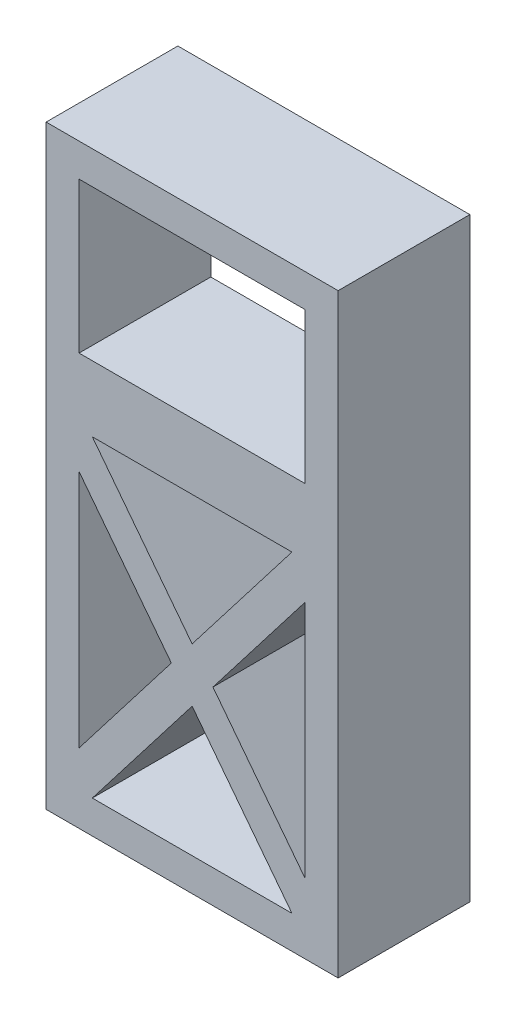
ISO-10303-21;
HEADER;
FILE_DESCRIPTION(('STEP AP214'),'2;1');
FILE_NAME('part.step','',(''),(''),'','','');
FILE_SCHEMA(('AUTOMOTIVE_DESIGN { 1 0 10303 214 1 1 1 1 }'));
ENDSEC;
DATA;
#1=APPLICATION_CONTEXT('core data for automotive mechanical design processes');
#2=APPLICATION_PROTOCOL_DEFINITION('international standard','automotive_design',2000,#1);
#3=PRODUCT_CONTEXT('',#1,'mechanical');
#4=PRODUCT('Part','Part','',(#3));
#5=PRODUCT_RELATED_PRODUCT_CATEGORY('part','',(#4));
#6=PRODUCT_DEFINITION_FORMATION('','',#4);
#7=PRODUCT_DEFINITION_CONTEXT('part definition',#1,'design');
#8=PRODUCT_DEFINITION('design','',#6,#7);
#9=PRODUCT_DEFINITION_SHAPE('','',#8);
#10=(LENGTH_UNIT() NAMED_UNIT(*) SI_UNIT(.MILLI.,.METRE.));
#11=(NAMED_UNIT(*) PLANE_ANGLE_UNIT() SI_UNIT($,.RADIAN.));
#12=(NAMED_UNIT(*) SI_UNIT($,.STERADIAN.) SOLID_ANGLE_UNIT());
#13=UNCERTAINTY_MEASURE_WITH_UNIT(LENGTH_MEASURE(1.E-05),#10,'distance_accuracy_value','');
#14=(GEOMETRIC_REPRESENTATION_CONTEXT(3) GLOBAL_UNCERTAINTY_ASSIGNED_CONTEXT((#13)) GLOBAL_UNIT_ASSIGNED_CONTEXT((#10,
#11,#12)) REPRESENTATION_CONTEXT('',''));
#15=CARTESIAN_POINT('',(0.,0.,0.));
#16=DIRECTION('',(0.,0.,1.));
#17=DIRECTION('',(1.,0.,0.));
#18=AXIS2_PLACEMENT_3D('',#15,#16,#17);
#19=CARTESIAN_POINT('',(0.,0.,25.4));
#20=DIRECTION('',(0.,0.,-1.));
#21=DIRECTION('',(-1.,0.,0.));
#22=AXIS2_PLACEMENT_3D('',#19,#20,#21);
#23=PLANE('',#22);
#24=DIRECTION('',(-0.610575177690363,0.791958302177824,0.));
#25=VECTOR('',#24,1.);
#26=CARTESIAN_POINT('',(0.,-62.587514897689,25.4));
#27=LINE('',#26,#25);
#28=CARTESIAN_POINT('',(19.245298338527,-87.550000033,25.4));
#29=VERTEX_POINT('',#28);
#30=CARTESIAN_POINT('',(0.,-62.587514897689,25.4));
#31=VERTEX_POINT('',#30);
#32=EDGE_CURVE('E197',#29,#31,#27,.T.);
#33=ORIENTED_EDGE('',*,*,#32,.F.);
#34=DIRECTION('',(1.,0.,0.));
#35=VECTOR('',#34,1.);
#36=CARTESIAN_POINT('',(19.245298338527,-87.550000033,25.4));
#37=LINE('',#36,#35);
#38=CARTESIAN_POINT('',(-19.245298338527,-87.550000033,25.4));
#39=VERTEX_POINT('',#38);
#40=EDGE_CURVE('E203',#39,#29,#37,.T.);
#41=ORIENTED_EDGE('',*,*,#40,.F.);
#42=DIRECTION('',(-0.610575177690363,-0.791958302177824,0.));
#43=VECTOR('',#42,1.);
#44=CARTESIAN_POINT('',(0.,-62.587514897689,25.4));
#45=LINE('',#44,#43);
#46=EDGE_CURVE('E199',#31,#39,#45,.T.);
#47=ORIENTED_EDGE('',*,*,#46,.F.);
#48=EDGE_LOOP('',(#33,#41,#47));
#49=FACE_BOUND('',#48,.T.);
#50=DIRECTION('',(0.610575177690363,0.791958302177824,0.));
#51=VECTOR('',#50,1.);
#52=CARTESIAN_POINT('',(19.245298338527,-27.225000033,25.4));
#53=LINE('',#52,#51);
#54=CARTESIAN_POINT('',(0.,-52.187485168311,25.4));
#55=VERTEX_POINT('',#54);
#56=CARTESIAN_POINT('',(19.245298338527,-27.225000033,25.4));
#57=VERTEX_POINT('',#56);
#58=EDGE_CURVE('E245',#55,#57,#53,.T.);
#59=ORIENTED_EDGE('',*,*,#58,.F.);
#60=DIRECTION('',(0.610575177690363,-0.791958302177824,0.));
#61=VECTOR('',#60,1.);
#62=CARTESIAN_POINT('',(-19.245298338527,-27.225000033,25.4));
#63=LINE('',#62,#61);
#64=CARTESIAN_POINT('',(-19.245298338527,-27.225000033,25.4));
#65=VERTEX_POINT('',#64);
#66=EDGE_CURVE('E251',#65,#55,#63,.T.);
#67=ORIENTED_EDGE('',*,*,#66,.F.);
#68=DIRECTION('',(-1.,0.,0.));
#69=VECTOR('',#68,1.);
#70=CARTESIAN_POINT('',(-19.245298338527,-27.225000033,25.4));
#71=LINE('',#70,#69);
#72=EDGE_CURVE('E247',#57,#65,#71,.T.);
#73=ORIENTED_EDGE('',*,*,#72,.F.);
#74=EDGE_LOOP('',(#59,#67,#73));
#75=FACE_BOUND('',#74,.T.);
#76=DIRECTION('',(0.,1.,0.));
#77=VECTOR('',#76,1.);
#78=CARTESIAN_POINT('',(28.149999961,-20.875000033,25.4));
#79=LINE('',#78,#77);
#80=CARTESIAN_POINT('',(28.149999961,-93.900000033,25.4));
#81=VERTEX_POINT('',#80);
#82=CARTESIAN_POINT('',(28.149999961,20.875000033,25.4));
#83=VERTEX_POINT('',#82);
#84=EDGE_CURVE('E300',#81,#83,#79,.T.);
#85=ORIENTED_EDGE('',*,*,#84,.T.);
#86=DIRECTION('',(-1.,0.,0.));
#87=VECTOR('',#86,1.);
#88=CARTESIAN_POINT('',(-28.149999961,20.875000033,25.4));
#89=LINE('',#88,#87);
#90=CARTESIAN_POINT('',(-28.149999961,20.875000033,25.4));
#91=VERTEX_POINT('',#90);
#92=EDGE_CURVE('E303',#83,#91,#89,.T.);
#93=ORIENTED_EDGE('',*,*,#92,.T.);
#94=DIRECTION('',(0.,-1.,0.));
#95=VECTOR('',#94,1.);
#96=CARTESIAN_POINT('',(-28.149999961,-20.875000033,25.4));
#97=LINE('',#96,#95);
#98=CARTESIAN_POINT('',(-28.149999961,-93.900000033,25.4));
#99=VERTEX_POINT('',#98);
#100=EDGE_CURVE('E306',#91,#99,#97,.T.);
#101=ORIENTED_EDGE('',*,*,#100,.T.);
#102=DIRECTION('',(1.,0.,0.));
#103=VECTOR('',#102,1.);
#104=CARTESIAN_POINT('',(-28.149999961,-93.900000033,25.4));
#105=LINE('',#104,#103);
#106=EDGE_CURVE('E308',#99,#81,#105,.T.);
#107=ORIENTED_EDGE('',*,*,#106,.T.);
#108=EDGE_LOOP('',(#85,#93,#101,#107));
#109=FACE_BOUND('',#108,.T.);
#110=DIRECTION('',(0.,1.,0.));
#111=VECTOR('',#110,1.);
#112=CARTESIAN_POINT('',(21.799999961,14.525000033,25.4));
#113=LINE('',#112,#111);
#114=CARTESIAN_POINT('',(21.799999961,-14.525000033,25.4));
#115=VERTEX_POINT('',#114);
#116=CARTESIAN_POINT('',(21.799999961,14.525000033,25.4));
#117=VERTEX_POINT('',#116);
#118=EDGE_CURVE('E269',#115,#117,#113,.T.);
#119=ORIENTED_EDGE('',*,*,#118,.F.);
#120=DIRECTION('',(1.,0.,0.));
#121=VECTOR('',#120,1.);
#122=CARTESIAN_POINT('',(-21.799999961,-14.525000033,25.4));
#123=LINE('',#122,#121);
#124=CARTESIAN_POINT('',(-21.799999961,-14.525000033,25.4));
#125=VERTEX_POINT('',#124);
#126=EDGE_CURVE('E277',#125,#115,#123,.T.);
#127=ORIENTED_EDGE('',*,*,#126,.F.);
#128=DIRECTION('',(0.,-1.,0.));
#129=VECTOR('',#128,1.);
#130=CARTESIAN_POINT('',(-21.799999961,14.525000033,25.4));
#131=LINE('',#130,#129);
#132=CARTESIAN_POINT('',(-21.799999961,14.525000033,25.4));
#133=VERTEX_POINT('',#132);
#134=EDGE_CURVE('E274',#133,#125,#131,.T.);
#135=ORIENTED_EDGE('',*,*,#134,.F.);
#136=DIRECTION('',(-1.,0.,0.));
#137=VECTOR('',#136,1.);
#138=CARTESIAN_POINT('',(-21.799999961,14.525000033,25.4));
#139=LINE('',#138,#137);
#140=EDGE_CURVE('E271',#117,#133,#139,.T.);
#141=ORIENTED_EDGE('',*,*,#140,.F.);
#142=EDGE_LOOP('',(#119,#127,#135,#141));
#143=FACE_BOUND('',#142,.T.);
#144=DIRECTION('',(0.610575177690363,-0.791958302177824,0.));
#145=VECTOR('',#144,1.);
#146=CARTESIAN_POINT('',(4.00904945534255,-57.387500033,25.4));
#147=LINE('',#146,#145);
#148=CARTESIAN_POINT('',(4.00904945534255,-57.387500033,25.4));
#149=VERTEX_POINT('',#148);
#150=CARTESIAN_POINT('',(21.799999961,-80.463595281234,25.4));
#151=VERTEX_POINT('',#150);
#152=EDGE_CURVE('E221',#149,#151,#147,.T.);
#153=ORIENTED_EDGE('',*,*,#152,.F.);
#154=DIRECTION('',(-0.610575177690362,-0.791958302177824,0.));
#155=VECTOR('',#154,1.);
#156=CARTESIAN_POINT('',(21.799999961,-34.311404784766,25.4));
#157=LINE('',#156,#155);
#158=CARTESIAN_POINT('',(21.799999961,-34.311404784766,25.4));
#159=VERTEX_POINT('',#158);
#160=EDGE_CURVE('E227',#159,#149,#157,.T.);
#161=ORIENTED_EDGE('',*,*,#160,.F.);
#162=DIRECTION('',(0.,1.,0.));
#163=VECTOR('',#162,1.);
#164=CARTESIAN_POINT('',(21.799999961,-34.311404784766,25.4));
#165=LINE('',#164,#163);
#166=EDGE_CURVE('E223',#151,#159,#165,.T.);
#167=ORIENTED_EDGE('',*,*,#166,.F.);
#168=EDGE_LOOP('',(#153,#161,#167));
#169=FACE_BOUND('',#168,.T.);
#170=DIRECTION('',(-0.610575177690363,0.791958302177824,0.));
#171=VECTOR('',#170,1.);
#172=CARTESIAN_POINT('',(-21.799999961,-34.311404784766,25.4));
#173=LINE('',#172,#171);
#174=CARTESIAN_POINT('',(-4.00904945534252,-57.387500033,25.4));
#175=VERTEX_POINT('',#174);
#176=CARTESIAN_POINT('',(-21.799999961,-34.311404784766,25.4));
#177=VERTEX_POINT('',#176);
#178=EDGE_CURVE('E170',#175,#177,#173,.T.);
#179=ORIENTED_EDGE('',*,*,#178,.F.);
#180=DIRECTION('',(0.610575177690362,0.791958302177825,0.));
#181=VECTOR('',#180,1.);
#182=CARTESIAN_POINT('',(-4.00904945534252,-57.387500033,25.4));
#183=LINE('',#182,#181);
#184=CARTESIAN_POINT('',(-21.799999961,-80.463595281234,25.4));
#185=VERTEX_POINT('',#184);
#186=EDGE_CURVE('E187',#185,#175,#183,.T.);
#187=ORIENTED_EDGE('',*,*,#186,.F.);
#188=DIRECTION('',(0.,-1.,0.));
#189=VECTOR('',#188,1.);
#190=CARTESIAN_POINT('',(-21.799999961,-80.463595281234,25.4));
#191=LINE('',#190,#189);
#192=EDGE_CURVE('E178',#177,#185,#191,.T.);
#193=ORIENTED_EDGE('',*,*,#192,.F.);
#194=EDGE_LOOP('',(#179,#187,#193));
#195=FACE_BOUND('',#194,.T.);
#196=ADVANCED_FACE('F33',(#49,#75,#109,#143,#169,#195),#23,.F.);
#197=CARTESIAN_POINT('',(0.,0.,0.));
#198=DIRECTION('',(0.,0.,-1.));
#199=DIRECTION('',(-1.,0.,0.));
#200=AXIS2_PLACEMENT_3D('',#197,#198,#199);
#201=PLANE('',#200);
#202=DIRECTION('',(-1.,0.,0.));
#203=VECTOR('',#202,1.);
#204=CARTESIAN_POINT('',(-28.149999961,20.875000033,0.));
#205=LINE('',#204,#203);
#206=CARTESIAN_POINT('',(28.149999961,20.875000033,0.));
#207=VERTEX_POINT('',#206);
#208=CARTESIAN_POINT('',(-28.149999961,20.875000033,0.));
#209=VERTEX_POINT('',#208);
#210=EDGE_CURVE('E299',#207,#209,#205,.T.);
#211=ORIENTED_EDGE('',*,*,#210,.F.);
#212=DIRECTION('',(0.,1.,0.));
#213=VECTOR('',#212,1.);
#214=CARTESIAN_POINT('',(28.149999961,-20.875000033,0.));
#215=LINE('',#214,#213);
#216=CARTESIAN_POINT('',(28.149999961,-93.900000033,0.));
#217=VERTEX_POINT('',#216);
#218=EDGE_CURVE('E304',#217,#207,#215,.T.);
#219=ORIENTED_EDGE('',*,*,#218,.F.);
#220=DIRECTION('',(1.,0.,0.));
#221=VECTOR('',#220,1.);
#222=CARTESIAN_POINT('',(-28.149999961,-93.900000033,0.));
#223=LINE('',#222,#221);
#224=CARTESIAN_POINT('',(-28.149999961,-93.900000033,0.));
#225=VERTEX_POINT('',#224);
#226=EDGE_CURVE('E316',#225,#217,#223,.T.);
#227=ORIENTED_EDGE('',*,*,#226,.F.);
#228=DIRECTION('',(0.,-1.,0.));
#229=VECTOR('',#228,1.);
#230=CARTESIAN_POINT('',(-28.149999961,-20.875000033,0.));
#231=LINE('',#230,#229);
#232=EDGE_CURVE('E314',#209,#225,#231,.T.);
#233=ORIENTED_EDGE('',*,*,#232,.F.);
#234=EDGE_LOOP('',(#211,#219,#227,#233));
#235=FACE_BOUND('',#234,.T.);
#236=DIRECTION('',(1.,0.,0.));
#237=VECTOR('',#236,1.);
#238=CARTESIAN_POINT('',(-21.799999961,-14.525000033,0.));
#239=LINE('',#238,#237);
#240=CARTESIAN_POINT('',(-21.799999961,-14.525000033,0.));
#241=VERTEX_POINT('',#240);
#242=CARTESIAN_POINT('',(21.799999961,-14.525000033,0.));
#243=VERTEX_POINT('',#242);
#244=EDGE_CURVE('E272',#241,#243,#239,.T.);
#245=ORIENTED_EDGE('',*,*,#244,.T.);
#246=DIRECTION('',(0.,1.,0.));
#247=VECTOR('',#246,1.);
#248=CARTESIAN_POINT('',(21.799999961,14.525000033,0.));
#249=LINE('',#248,#247);
#250=CARTESIAN_POINT('',(21.799999961,14.525000033,0.));
#251=VERTEX_POINT('',#250);
#252=EDGE_CURVE('E268',#243,#251,#249,.T.);
#253=ORIENTED_EDGE('',*,*,#252,.T.);
#254=DIRECTION('',(-1.,0.,0.));
#255=VECTOR('',#254,1.);
#256=CARTESIAN_POINT('',(-21.799999961,14.525000033,0.));
#257=LINE('',#256,#255);
#258=CARTESIAN_POINT('',(-21.799999961,14.525000033,0.));
#259=VERTEX_POINT('',#258);
#260=EDGE_CURVE('E282',#251,#259,#257,.T.);
#261=ORIENTED_EDGE('',*,*,#260,.T.);
#262=DIRECTION('',(0.,-1.,0.));
#263=VECTOR('',#262,1.);
#264=CARTESIAN_POINT('',(-21.799999961,14.525000033,0.));
#265=LINE('',#264,#263);
#266=EDGE_CURVE('E285',#259,#241,#265,.T.);
#267=ORIENTED_EDGE('',*,*,#266,.T.);
#268=EDGE_LOOP('',(#245,#253,#261,#267));
#269=FACE_BOUND('',#268,.T.);
#270=DIRECTION('',(0.610575177690363,-0.791958302177824,0.));
#271=VECTOR('',#270,1.);
#272=CARTESIAN_POINT('',(-19.245298338527,-27.225000033,0.));
#273=LINE('',#272,#271);
#274=CARTESIAN_POINT('',(-19.245298338527,-27.225000033,0.));
#275=VERTEX_POINT('',#274);
#276=CARTESIAN_POINT('',(0.,-52.187485168311,0.));
#277=VERTEX_POINT('',#276);
#278=EDGE_CURVE('E248',#275,#277,#273,.T.);
#279=ORIENTED_EDGE('',*,*,#278,.T.);
#280=DIRECTION('',(0.610575177690363,0.791958302177824,0.));
#281=VECTOR('',#280,1.);
#282=CARTESIAN_POINT('',(19.245298338527,-27.225000033,0.));
#283=LINE('',#282,#281);
#284=CARTESIAN_POINT('',(19.245298338527,-27.225000033,0.));
#285=VERTEX_POINT('',#284);
#286=EDGE_CURVE('E244',#277,#285,#283,.T.);
#287=ORIENTED_EDGE('',*,*,#286,.T.);
#288=DIRECTION('',(-1.,0.,0.));
#289=VECTOR('',#288,1.);
#290=CARTESIAN_POINT('',(-19.245298338527,-27.225000033,0.));
#291=LINE('',#290,#289);
#292=EDGE_CURVE('E256',#285,#275,#291,.T.);
#293=ORIENTED_EDGE('',*,*,#292,.T.);
#294=EDGE_LOOP('',(#279,#287,#293));
#295=FACE_BOUND('',#294,.T.);
#296=DIRECTION('',(-0.610575177690362,-0.791958302177824,0.));
#297=VECTOR('',#296,1.);
#298=CARTESIAN_POINT('',(21.799999961,-34.311404784766,0.));
#299=LINE('',#298,#297);
#300=CARTESIAN_POINT('',(21.799999961,-34.311404784766,0.));
#301=VERTEX_POINT('',#300);
#302=CARTESIAN_POINT('',(4.00904945534256,-57.387500033,0.));
#303=VERTEX_POINT('',#302);
#304=EDGE_CURVE('E224',#301,#303,#299,.T.);
#305=ORIENTED_EDGE('',*,*,#304,.T.);
#306=DIRECTION('',(0.610575177690363,-0.791958302177824,0.));
#307=VECTOR('',#306,1.);
#308=CARTESIAN_POINT('',(4.00904945534255,-57.387500033,0.));
#309=LINE('',#308,#307);
#310=CARTESIAN_POINT('',(21.799999961,-80.463595281234,0.));
#311=VERTEX_POINT('',#310);
#312=EDGE_CURVE('E220',#303,#311,#309,.T.);
#313=ORIENTED_EDGE('',*,*,#312,.T.);
#314=DIRECTION('',(0.,1.,0.));
#315=VECTOR('',#314,1.);
#316=CARTESIAN_POINT('',(21.799999961,-34.311404784766,0.));
#317=LINE('',#316,#315);
#318=EDGE_CURVE('E232',#311,#301,#317,.T.);
#319=ORIENTED_EDGE('',*,*,#318,.T.);
#320=EDGE_LOOP('',(#305,#313,#319));
#321=FACE_BOUND('',#320,.T.);
#322=DIRECTION('',(1.,0.,0.));
#323=VECTOR('',#322,1.);
#324=CARTESIAN_POINT('',(19.245298338527,-87.550000033,0.));
#325=LINE('',#324,#323);
#326=CARTESIAN_POINT('',(-19.245298338527,-87.550000033,0.));
#327=VERTEX_POINT('',#326);
#328=CARTESIAN_POINT('',(19.245298338527,-87.550000033,0.));
#329=VERTEX_POINT('',#328);
#330=EDGE_CURVE('E200',#327,#329,#325,.T.);
#331=ORIENTED_EDGE('',*,*,#330,.T.);
#332=DIRECTION('',(-0.610575177690363,0.791958302177824,0.));
#333=VECTOR('',#332,1.);
#334=CARTESIAN_POINT('',(0.,-62.587514897689,0.));
#335=LINE('',#334,#333);
#336=CARTESIAN_POINT('',(0.,-62.587514897689,0.));
#337=VERTEX_POINT('',#336);
#338=EDGE_CURVE('E185',#329,#337,#335,.T.);
#339=ORIENTED_EDGE('',*,*,#338,.T.);
#340=DIRECTION('',(-0.610575177690363,-0.791958302177824,0.));
#341=VECTOR('',#340,1.);
#342=CARTESIAN_POINT('',(0.,-62.587514897689,0.));
#343=LINE('',#342,#341);
#344=EDGE_CURVE('E208',#337,#327,#343,.T.);
#345=ORIENTED_EDGE('',*,*,#344,.T.);
#346=EDGE_LOOP('',(#331,#339,#345));
#347=FACE_BOUND('',#346,.T.);
#348=DIRECTION('',(0.610575177690362,0.791958302177825,0.));
#349=VECTOR('',#348,1.);
#350=CARTESIAN_POINT('',(-4.00904945534252,-57.387500033,0.));
#351=LINE('',#350,#349);
#352=CARTESIAN_POINT('',(-21.799999961,-80.463595281234,0.));
#353=VERTEX_POINT('',#352);
#354=CARTESIAN_POINT('',(-4.00904945534251,-57.387500033,0.));
#355=VERTEX_POINT('',#354);
#356=EDGE_CURVE('E179',#353,#355,#351,.T.);
#357=ORIENTED_EDGE('',*,*,#356,.T.);
#358=DIRECTION('',(-0.610575177690363,0.791958302177824,0.));
#359=VECTOR('',#358,1.);
#360=CARTESIAN_POINT('',(-21.799999961,-34.311404784766,0.));
#361=LINE('',#360,#359);
#362=CARTESIAN_POINT('',(-21.799999961,-34.311404784766,0.));
#363=VERTEX_POINT('',#362);
#364=EDGE_CURVE('E56',#355,#363,#361,.T.);
#365=ORIENTED_EDGE('',*,*,#364,.T.);
#366=DIRECTION('',(0.,-1.,0.));
#367=VECTOR('',#366,1.);
#368=CARTESIAN_POINT('',(-21.799999961,-80.463595281234,0.));
#369=LINE('',#368,#367);
#370=EDGE_CURVE('E184',#363,#353,#369,.T.);
#371=ORIENTED_EDGE('',*,*,#370,.T.);
#372=EDGE_LOOP('',(#357,#365,#371));
#373=FACE_BOUND('',#372,.T.);
#374=ADVANCED_FACE('F334',(#235,#269,#295,#321,#347,#373),#201,.T.);
#375=CARTESIAN_POINT('',(-28.149999961,20.875000033,25.4));
#376=DIRECTION('',(0.,-1.,0.));
#377=DIRECTION('',(0.,0.,-1.));
#378=AXIS2_PLACEMENT_3D('',#375,#376,#377);
#379=PLANE('',#378);
#380=ORIENTED_EDGE('',*,*,#210,.T.);
#381=DIRECTION('',(0.,0.,-1.));
#382=VECTOR('',#381,1.);
#383=CARTESIAN_POINT('',(-28.149999961,20.875000033,25.4));
#384=LINE('',#383,#382);
#385=EDGE_CURVE('E41',#91,#209,#384,.T.);
#386=ORIENTED_EDGE('',*,*,#385,.F.);
#387=ORIENTED_EDGE('',*,*,#92,.F.);
#388=DIRECTION('',(0.,0.,-1.));
#389=VECTOR('',#388,1.);
#390=CARTESIAN_POINT('',(28.149999961,20.875000033,25.4));
#391=LINE('',#390,#389);
#392=EDGE_CURVE('E11',#83,#207,#391,.T.);
#393=ORIENTED_EDGE('',*,*,#392,.T.);
#394=EDGE_LOOP('',(#380,#386,#387,#393));
#395=FACE_BOUND('',#394,.T.);
#396=ADVANCED_FACE('F35',(#395),#379,.F.);
#397=CARTESIAN_POINT('',(-28.149999961,-20.875000033,25.4));
#398=DIRECTION('',(1.,0.,0.));
#399=DIRECTION('',(0.,1.,0.));
#400=AXIS2_PLACEMENT_3D('',#397,#398,#399);
#401=PLANE('',#400);
#402=ORIENTED_EDGE('',*,*,#232,.T.);
#403=DIRECTION('',(0.,0.,-1.));
#404=VECTOR('',#403,1.);
#405=CARTESIAN_POINT('',(-28.149999961,-93.900000033,25.4));
#406=LINE('',#405,#404);
#407=EDGE_CURVE('E321',#99,#225,#406,.T.);
#408=ORIENTED_EDGE('',*,*,#407,.F.);
#409=ORIENTED_EDGE('',*,*,#100,.F.);
#410=ORIENTED_EDGE('',*,*,#385,.T.);
#411=EDGE_LOOP('',(#402,#408,#409,#410));
#412=FACE_BOUND('',#411,.T.);
#413=ADVANCED_FACE('F327',(#412),#401,.F.);
#414=CARTESIAN_POINT('',(-28.149999961,-93.900000033,25.4));
#415=DIRECTION('',(0.,1.,0.));
#416=DIRECTION('',(0.,0.,1.));
#417=AXIS2_PLACEMENT_3D('',#414,#415,#416);
#418=PLANE('',#417);
#419=ORIENTED_EDGE('',*,*,#226,.T.);
#420=DIRECTION('',(0.,0.,-1.));
#421=VECTOR('',#420,1.);
#422=CARTESIAN_POINT('',(28.149999961,-93.900000033,25.4));
#423=LINE('',#422,#421);
#424=EDGE_CURVE('E311',#81,#217,#423,.T.);
#425=ORIENTED_EDGE('',*,*,#424,.F.);
#426=ORIENTED_EDGE('',*,*,#106,.F.);
#427=ORIENTED_EDGE('',*,*,#407,.T.);
#428=EDGE_LOOP('',(#419,#425,#426,#427));
#429=FACE_BOUND('',#428,.T.);
#430=ADVANCED_FACE('F339',(#429),#418,.F.);
#431=CARTESIAN_POINT('',(28.149999961,-20.875000033,25.4));
#432=DIRECTION('',(-1.,0.,0.));
#433=DIRECTION('',(0.,-1.,0.));
#434=AXIS2_PLACEMENT_3D('',#431,#432,#433);
#435=PLANE('',#434);
#436=ORIENTED_EDGE('',*,*,#218,.T.);
#437=ORIENTED_EDGE('',*,*,#392,.F.);
#438=ORIENTED_EDGE('',*,*,#84,.F.);
#439=ORIENTED_EDGE('',*,*,#424,.T.);
#440=EDGE_LOOP('',(#436,#437,#438,#439));
#441=FACE_BOUND('',#440,.T.);
#442=ADVANCED_FACE('F342',(#441),#435,.F.);
#443=CARTESIAN_POINT('',(21.799999961,14.525000033,25.4));
#444=DIRECTION('',(-1.,0.,0.));
#445=DIRECTION('',(0.,-1.,0.));
#446=AXIS2_PLACEMENT_3D('',#443,#444,#445);
#447=PLANE('',#446);
#448=ORIENTED_EDGE('',*,*,#252,.F.);
#449=DIRECTION('',(0.,0.,-1.));
#450=VECTOR('',#449,1.);
#451=CARTESIAN_POINT('',(21.799999961,-14.525000033,25.4));
#452=LINE('',#451,#450);
#453=EDGE_CURVE('E279',#115,#243,#452,.T.);
#454=ORIENTED_EDGE('',*,*,#453,.F.);
#455=ORIENTED_EDGE('',*,*,#118,.T.);
#456=DIRECTION('',(0.,0.,-1.));
#457=VECTOR('',#456,1.);
#458=CARTESIAN_POINT('',(21.799999961,14.525000033,25.4));
#459=LINE('',#458,#457);
#460=EDGE_CURVE('E296',#117,#251,#459,.T.);
#461=ORIENTED_EDGE('',*,*,#460,.T.);
#462=EDGE_LOOP('',(#448,#454,#455,#461));
#463=FACE_BOUND('',#462,.T.);
#464=ADVANCED_FACE('F404',(#463),#447,.T.);
#465=CARTESIAN_POINT('',(-21.799999961,14.525000033,25.4));
#466=DIRECTION('',(0.,-1.,0.));
#467=DIRECTION('',(0.,0.,-1.));
#468=AXIS2_PLACEMENT_3D('',#465,#466,#467);
#469=PLANE('',#468);
#470=ORIENTED_EDGE('',*,*,#260,.F.);
#471=ORIENTED_EDGE('',*,*,#460,.F.);
#472=ORIENTED_EDGE('',*,*,#140,.T.);
#473=DIRECTION('',(0.,0.,-1.));
#474=VECTOR('',#473,1.);
#475=CARTESIAN_POINT('',(-21.799999961,14.525000033,25.4));
#476=LINE('',#475,#474);
#477=EDGE_CURVE('E294',#133,#259,#476,.T.);
#478=ORIENTED_EDGE('',*,*,#477,.T.);
#479=EDGE_LOOP('',(#470,#471,#472,#478));
#480=FACE_BOUND('',#479,.T.);
#481=ADVANCED_FACE('F400',(#480),#469,.T.);
#482=CARTESIAN_POINT('',(-21.799999961,14.525000033,25.4));
#483=DIRECTION('',(1.,0.,0.));
#484=DIRECTION('',(0.,1.,0.));
#485=AXIS2_PLACEMENT_3D('',#482,#483,#484);
#486=PLANE('',#485);
#487=ORIENTED_EDGE('',*,*,#266,.F.);
#488=ORIENTED_EDGE('',*,*,#477,.F.);
#489=ORIENTED_EDGE('',*,*,#134,.T.);
#490=DIRECTION('',(0.,0.,-1.));
#491=VECTOR('',#490,1.);
#492=CARTESIAN_POINT('',(-21.799999961,-14.525000033,25.4));
#493=LINE('',#492,#491);
#494=EDGE_CURVE('E292',#125,#241,#493,.T.);
#495=ORIENTED_EDGE('',*,*,#494,.T.);
#496=EDGE_LOOP('',(#487,#488,#489,#495));
#497=FACE_BOUND('',#496,.T.);
#498=ADVANCED_FACE('F396',(#497),#486,.T.);
#499=CARTESIAN_POINT('',(-21.799999961,-14.525000033,25.4));
#500=DIRECTION('',(0.,1.,0.));
#501=DIRECTION('',(0.,0.,1.));
#502=AXIS2_PLACEMENT_3D('',#499,#500,#501);
#503=PLANE('',#502);
#504=ORIENTED_EDGE('',*,*,#244,.F.);
#505=ORIENTED_EDGE('',*,*,#494,.F.);
#506=ORIENTED_EDGE('',*,*,#126,.T.);
#507=ORIENTED_EDGE('',*,*,#453,.T.);
#508=EDGE_LOOP('',(#504,#505,#506,#507));
#509=FACE_BOUND('',#508,.T.);
#510=ADVANCED_FACE('F392',(#509),#503,.T.);
#511=CARTESIAN_POINT('',(19.245298338527,-27.225000033,25.4));
#512=DIRECTION('',(-0.791958302177824,0.610575177690363,0.));
#513=DIRECTION('',(-0.610575177690363,-0.791958302177824,0.));
#514=AXIS2_PLACEMENT_3D('',#511,#512,#513);
#515=PLANE('',#514);
#516=ORIENTED_EDGE('',*,*,#286,.F.);
#517=DIRECTION('',(0.,0.,-1.));
#518=VECTOR('',#517,1.);
#519=CARTESIAN_POINT('',(0.,-52.187485168311,25.4));
#520=LINE('',#519,#518);
#521=EDGE_CURVE('E253',#55,#277,#520,.T.);
#522=ORIENTED_EDGE('',*,*,#521,.F.);
#523=ORIENTED_EDGE('',*,*,#58,.T.);
#524=DIRECTION('',(0.,0.,-1.));
#525=VECTOR('',#524,1.);
#526=CARTESIAN_POINT('',(19.245298338527,-27.225000033,25.4));
#527=LINE('',#526,#525);
#528=EDGE_CURVE('E265',#57,#285,#527,.T.);
#529=ORIENTED_EDGE('',*,*,#528,.T.);
#530=EDGE_LOOP('',(#516,#522,#523,#529));
#531=FACE_BOUND('',#530,.T.);
#532=ADVANCED_FACE('F388',(#531),#515,.T.);
#533=CARTESIAN_POINT('',(-19.245298338527,-27.225000033,25.4));
#534=DIRECTION('',(0.,-1.,0.));
#535=DIRECTION('',(0.,0.,-1.));
#536=AXIS2_PLACEMENT_3D('',#533,#534,#535);
#537=PLANE('',#536);
#538=ORIENTED_EDGE('',*,*,#292,.F.);
#539=ORIENTED_EDGE('',*,*,#528,.F.);
#540=ORIENTED_EDGE('',*,*,#72,.T.);
#541=DIRECTION('',(0.,0.,-1.));
#542=VECTOR('',#541,1.);
#543=CARTESIAN_POINT('',(-19.245298338527,-27.225000033,25.4));
#544=LINE('',#543,#542);
#545=EDGE_CURVE('E263',#65,#275,#544,.T.);
#546=ORIENTED_EDGE('',*,*,#545,.T.);
#547=EDGE_LOOP('',(#538,#539,#540,#546));
#548=FACE_BOUND('',#547,.T.);
#549=ADVANCED_FACE('F384',(#548),#537,.T.);
#550=CARTESIAN_POINT('',(-19.245298338527,-27.225000033,25.4));
#551=DIRECTION('',(0.791958302177824,0.610575177690363,0.));
#552=DIRECTION('',(-0.610575177690363,0.791958302177824,0.));
#553=AXIS2_PLACEMENT_3D('',#550,#551,#552);
#554=PLANE('',#553);
#555=ORIENTED_EDGE('',*,*,#278,.F.);
#556=ORIENTED_EDGE('',*,*,#545,.F.);
#557=ORIENTED_EDGE('',*,*,#66,.T.);
#558=ORIENTED_EDGE('',*,*,#521,.T.);
#559=EDGE_LOOP('',(#555,#556,#557,#558));
#560=FACE_BOUND('',#559,.T.);
#561=ADVANCED_FACE('F381',(#560),#554,.T.);
#562=CARTESIAN_POINT('',(4.00904945534255,-57.387500033,25.4));
#563=DIRECTION('',(0.791958302177824,0.610575177690363,0.));
#564=DIRECTION('',(-0.610575177690363,0.791958302177824,0.));
#565=AXIS2_PLACEMENT_3D('',#562,#563,#564);
#566=PLANE('',#565);
#567=ORIENTED_EDGE('',*,*,#312,.F.);
#568=DIRECTION('',(0.,0.,-1.));
#569=VECTOR('',#568,1.);
#570=CARTESIAN_POINT('',(4.00904945534255,-57.387500033,25.4));
#571=LINE('',#570,#569);
#572=EDGE_CURVE('E229',#149,#303,#571,.T.);
#573=ORIENTED_EDGE('',*,*,#572,.F.);
#574=ORIENTED_EDGE('',*,*,#152,.T.);
#575=DIRECTION('',(0.,0.,-1.));
#576=VECTOR('',#575,1.);
#577=CARTESIAN_POINT('',(21.799999961,-80.463595281234,25.4));
#578=LINE('',#577,#576);
#579=EDGE_CURVE('E241',#151,#311,#578,.T.);
#580=ORIENTED_EDGE('',*,*,#579,.T.);
#581=EDGE_LOOP('',(#567,#573,#574,#580));
#582=FACE_BOUND('',#581,.T.);
#583=ADVANCED_FACE('F358',(#582),#566,.T.);
#584=CARTESIAN_POINT('',(21.799999961,-34.311404784766,25.4));
#585=DIRECTION('',(-1.,0.,0.));
#586=DIRECTION('',(0.,-1.,0.));
#587=AXIS2_PLACEMENT_3D('',#584,#585,#586);
#588=PLANE('',#587);
#589=ORIENTED_EDGE('',*,*,#318,.F.);
#590=ORIENTED_EDGE('',*,*,#579,.F.);
#591=ORIENTED_EDGE('',*,*,#166,.T.);
#592=DIRECTION('',(0.,0.,-1.));
#593=VECTOR('',#592,1.);
#594=CARTESIAN_POINT('',(21.799999961,-34.311404784766,25.4));
#595=LINE('',#594,#593);
#596=EDGE_CURVE('E239',#159,#301,#595,.T.);
#597=ORIENTED_EDGE('',*,*,#596,.T.);
#598=EDGE_LOOP('',(#589,#590,#591,#597));
#599=FACE_BOUND('',#598,.T.);
#600=ADVANCED_FACE('F360',(#599),#588,.T.);
#601=CARTESIAN_POINT('',(21.799999961,-34.311404784766,25.4));
#602=DIRECTION('',(0.791958302177825,-0.610575177690362,0.));
#603=DIRECTION('',(0.610575177690362,0.791958302177825,0.));
#604=AXIS2_PLACEMENT_3D('',#601,#602,#603);
#605=PLANE('',#604);
#606=ORIENTED_EDGE('',*,*,#304,.F.);
#607=ORIENTED_EDGE('',*,*,#596,.F.);
#608=ORIENTED_EDGE('',*,*,#160,.T.);
#609=ORIENTED_EDGE('',*,*,#572,.T.);
#610=EDGE_LOOP('',(#606,#607,#608,#609));
#611=FACE_BOUND('',#610,.T.);
#612=ADVANCED_FACE('F365',(#611),#605,.T.);
#613=CARTESIAN_POINT('',(0.,-62.587514897689,25.4));
#614=DIRECTION('',(-0.791958302177824,-0.610575177690362,0.));
#615=DIRECTION('',(0.610575177690363,-0.791958302177825,0.));
#616=AXIS2_PLACEMENT_3D('',#613,#614,#615);
#617=PLANE('',#616);
#618=ORIENTED_EDGE('',*,*,#338,.F.);
#619=DIRECTION('',(0.,0.,-1.));
#620=VECTOR('',#619,1.);
#621=CARTESIAN_POINT('',(19.245298338527,-87.550000033,25.4));
#622=LINE('',#621,#620);
#623=EDGE_CURVE('E205',#29,#329,#622,.T.);
#624=ORIENTED_EDGE('',*,*,#623,.F.);
#625=ORIENTED_EDGE('',*,*,#32,.T.);
#626=DIRECTION('',(0.,0.,-1.));
#627=VECTOR('',#626,1.);
#628=CARTESIAN_POINT('',(0.,-62.587514897689,25.4));
#629=LINE('',#628,#627);
#630=EDGE_CURVE('E217',#31,#337,#629,.T.);
#631=ORIENTED_EDGE('',*,*,#630,.T.);
#632=EDGE_LOOP('',(#618,#624,#625,#631));
#633=FACE_BOUND('',#632,.T.);
#634=ADVANCED_FACE('F367',(#633),#617,.T.);
#635=CARTESIAN_POINT('',(0.,-62.587514897689,25.4));
#636=DIRECTION('',(0.791958302177824,-0.610575177690363,0.));
#637=DIRECTION('',(0.610575177690363,0.791958302177824,0.));
#638=AXIS2_PLACEMENT_3D('',#635,#636,#637);
#639=PLANE('',#638);
#640=ORIENTED_EDGE('',*,*,#344,.F.);
#641=ORIENTED_EDGE('',*,*,#630,.F.);
#642=ORIENTED_EDGE('',*,*,#46,.T.);
#643=DIRECTION('',(0.,0.,-1.));
#644=VECTOR('',#643,1.);
#645=CARTESIAN_POINT('',(-19.245298338527,-87.550000033,25.4));
#646=LINE('',#645,#644);
#647=EDGE_CURVE('E215',#39,#327,#646,.T.);
#648=ORIENTED_EDGE('',*,*,#647,.T.);
#649=EDGE_LOOP('',(#640,#641,#642,#648));
#650=FACE_BOUND('',#649,.T.);
#651=ADVANCED_FACE('F373',(#650),#639,.T.);
#652=CARTESIAN_POINT('',(19.245298338527,-87.550000033,25.4));
#653=DIRECTION('',(0.,1.,0.));
#654=DIRECTION('',(0.,0.,1.));
#655=AXIS2_PLACEMENT_3D('',#652,#653,#654);
#656=PLANE('',#655);
#657=ORIENTED_EDGE('',*,*,#330,.F.);
#658=ORIENTED_EDGE('',*,*,#647,.F.);
#659=ORIENTED_EDGE('',*,*,#40,.T.);
#660=ORIENTED_EDGE('',*,*,#623,.T.);
#661=EDGE_LOOP('',(#657,#658,#659,#660));
#662=FACE_BOUND('',#661,.T.);
#663=ADVANCED_FACE('F516',(#662),#656,.T.);
#664=CARTESIAN_POINT('',(-21.799999961,-34.311404784766,25.4));
#665=DIRECTION('',(-0.791958302177824,-0.610575177690363,0.));
#666=DIRECTION('',(0.610575177690363,-0.791958302177824,0.));
#667=AXIS2_PLACEMENT_3D('',#664,#665,#666);
#668=PLANE('',#667);
#669=ORIENTED_EDGE('',*,*,#364,.F.);
#670=DIRECTION('',(0.,0.,-1.));
#671=VECTOR('',#670,1.);
#672=CARTESIAN_POINT('',(-4.00904945534252,-57.387500033,25.4));
#673=LINE('',#672,#671);
#674=EDGE_CURVE('E174',#175,#355,#673,.T.);
#675=ORIENTED_EDGE('',*,*,#674,.F.);
#676=ORIENTED_EDGE('',*,*,#178,.T.);
#677=DIRECTION('',(0.,0.,-1.));
#678=VECTOR('',#677,1.);
#679=CARTESIAN_POINT('',(-21.799999961,-34.311404784766,25.4));
#680=LINE('',#679,#678);
#681=EDGE_CURVE('E173',#177,#363,#680,.T.);
#682=ORIENTED_EDGE('',*,*,#681,.T.);
#683=EDGE_LOOP('',(#669,#675,#676,#682));
#684=FACE_BOUND('',#683,.T.);
#685=ADVANCED_FACE('F172',(#684),#668,.T.);
#686=CARTESIAN_POINT('',(-21.799999961,-80.463595281234,25.4));
#687=DIRECTION('',(1.,0.,0.));
#688=DIRECTION('',(0.,0.,-1.));
#689=AXIS2_PLACEMENT_3D('',#686,#687,#688);
#690=PLANE('',#689);
#691=ORIENTED_EDGE('',*,*,#370,.F.);
#692=ORIENTED_EDGE('',*,*,#681,.F.);
#693=ORIENTED_EDGE('',*,*,#192,.T.);
#694=DIRECTION('',(0.,0.,-1.));
#695=VECTOR('',#694,1.);
#696=CARTESIAN_POINT('',(-21.799999961,-80.463595281234,25.4));
#697=LINE('',#696,#695);
#698=EDGE_CURVE('E48',#185,#353,#697,.T.);
#699=ORIENTED_EDGE('',*,*,#698,.T.);
#700=EDGE_LOOP('',(#691,#692,#693,#699));
#701=FACE_BOUND('',#700,.T.);
#702=ADVANCED_FACE('F182',(#701),#690,.T.);
#703=CARTESIAN_POINT('',(-4.00904945534252,-57.387500033,25.4));
#704=DIRECTION('',(-0.791958302177824,0.610575177690362,0.));
#705=DIRECTION('',(-0.610575177690362,-0.791958302177825,0.));
#706=AXIS2_PLACEMENT_3D('',#703,#704,#705);
#707=PLANE('',#706);
#708=ORIENTED_EDGE('',*,*,#356,.F.);
#709=ORIENTED_EDGE('',*,*,#698,.F.);
#710=ORIENTED_EDGE('',*,*,#186,.T.);
#711=ORIENTED_EDGE('',*,*,#674,.T.);
#712=EDGE_LOOP('',(#708,#709,#710,#711));
#713=FACE_BOUND('',#712,.T.);
#714=ADVANCED_FACE('F539',(#713),#707,.T.);
#715=CLOSED_SHELL('',(#196,#374,#396,#413,#430,#442,#464,#481,#498,#510,#532,#549,#561,#583,
#600,#612,#634,#651,#663,#685,#702,#714));
#716=MANIFOLD_SOLID_BREP('B2',#715);
#717=ADVANCED_BREP_SHAPE_REPRESENTATION('',(#18,#716),#14);
#718=SHAPE_DEFINITION_REPRESENTATION(#9,#717);
ENDSEC;
END-ISO-10303-21;
